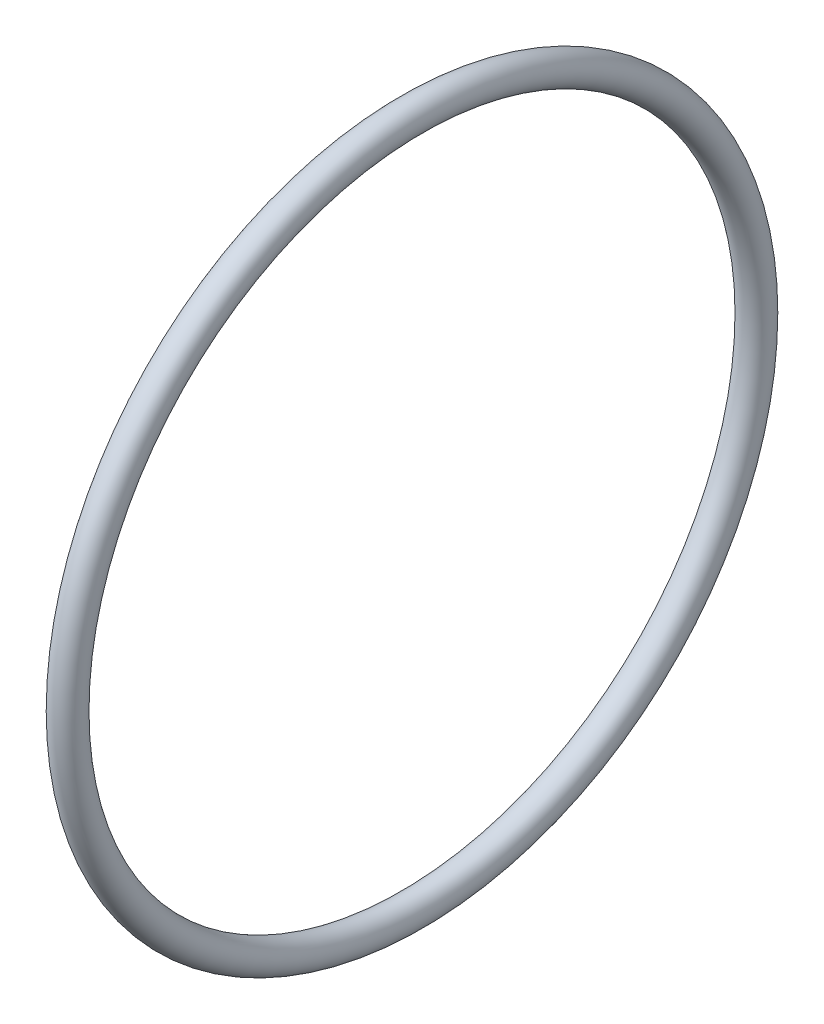
ISO-10303-21;
HEADER;
FILE_DESCRIPTION(('STEP AP214'),'2;1');
FILE_NAME('part.step','',(''),(''),'','','');
FILE_SCHEMA(('AUTOMOTIVE_DESIGN { 1 0 10303 214 1 1 1 1 }'));
ENDSEC;
DATA;
#1=APPLICATION_CONTEXT('core data for automotive mechanical design processes');
#2=APPLICATION_PROTOCOL_DEFINITION('international standard','automotive_design',2000,#1);
#3=PRODUCT_CONTEXT('',#1,'mechanical');
#4=PRODUCT('Part','Part','',(#3));
#5=PRODUCT_RELATED_PRODUCT_CATEGORY('part','',(#4));
#6=PRODUCT_DEFINITION_FORMATION('','',#4);
#7=PRODUCT_DEFINITION_CONTEXT('part definition',#1,'design');
#8=PRODUCT_DEFINITION('design','',#6,#7);
#9=PRODUCT_DEFINITION_SHAPE('','',#8);
#10=(LENGTH_UNIT() NAMED_UNIT(*) SI_UNIT(.MILLI.,.METRE.));
#11=(NAMED_UNIT(*) PLANE_ANGLE_UNIT() SI_UNIT($,.RADIAN.));
#12=(NAMED_UNIT(*) SI_UNIT($,.STERADIAN.) SOLID_ANGLE_UNIT());
#13=UNCERTAINTY_MEASURE_WITH_UNIT(LENGTH_MEASURE(1.E-05),#10,'distance_accuracy_value','');
#14=(GEOMETRIC_REPRESENTATION_CONTEXT(3) GLOBAL_UNCERTAINTY_ASSIGNED_CONTEXT((#13)) GLOBAL_UNIT_ASSIGNED_CONTEXT((#10,
#11,#12)) REPRESENTATION_CONTEXT('',''));
#15=CARTESIAN_POINT('',(0.,0.,0.));
#16=DIRECTION('',(0.,0.,1.));
#17=DIRECTION('',(1.,0.,0.));
#18=AXIS2_PLACEMENT_3D('',#15,#16,#17);
#19=CARTESIAN_POINT('',(1.99999999999999,0.,0.));
#20=DIRECTION('',(-1.,0.,0.));
#21=DIRECTION('',(0.,0.,1.));
#22=AXIS2_PLACEMENT_3D('',#19,#20,#21);
#23=TOROIDAL_SURFACE('',#22,45.5,2.);
#24=CARTESIAN_POINT('',(1.99999999999999,0.,47.5));
#25=VERTEX_POINT('',#24);
#26=VERTEX_LOOP('',#25);
#27=FACE_BOUND('',#26,.T.);
#28=ADVANCED_FACE('F40',(#27),#23,.T.);
#29=CLOSED_SHELL('',(#28));
#30=MANIFOLD_SOLID_BREP('B2',#29);
#31=ADVANCED_BREP_SHAPE_REPRESENTATION('',(#18,#30),#14);
#32=SHAPE_DEFINITION_REPRESENTATION(#9,#31);
ENDSEC;
END-ISO-10303-21;
